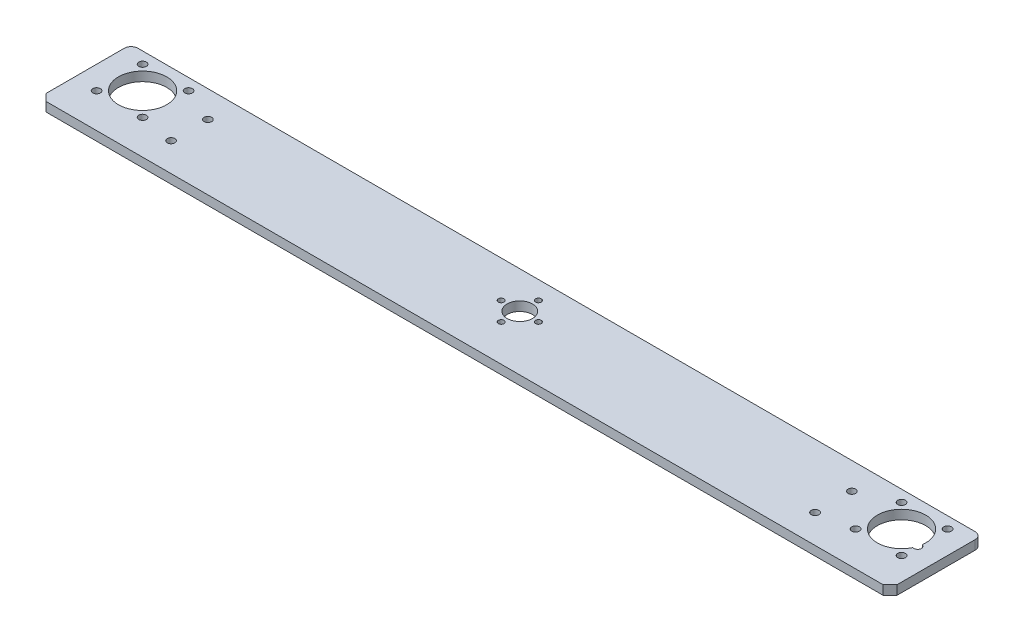
ISO-10303-21;
HEADER;
FILE_DESCRIPTION(('STEP AP214'),'2;1');
FILE_NAME('part.step','',(''),(''),'','','');
FILE_SCHEMA(('AUTOMOTIVE_DESIGN { 1 0 10303 214 1 1 1 1 }'));
ENDSEC;
DATA;
#1=APPLICATION_CONTEXT('core data for automotive mechanical design processes');
#2=APPLICATION_PROTOCOL_DEFINITION('international standard','automotive_design',2000,#1);
#3=PRODUCT_CONTEXT('',#1,'mechanical');
#4=PRODUCT('Part','Part','',(#3));
#5=PRODUCT_RELATED_PRODUCT_CATEGORY('part','',(#4));
#6=PRODUCT_DEFINITION_FORMATION('','',#4);
#7=PRODUCT_DEFINITION_CONTEXT('part definition',#1,'design');
#8=PRODUCT_DEFINITION('design','',#6,#7);
#9=PRODUCT_DEFINITION_SHAPE('','',#8);
#10=(LENGTH_UNIT() NAMED_UNIT(*) SI_UNIT(.MILLI.,.METRE.));
#11=(NAMED_UNIT(*) PLANE_ANGLE_UNIT() SI_UNIT($,.RADIAN.));
#12=(NAMED_UNIT(*) SI_UNIT($,.STERADIAN.) SOLID_ANGLE_UNIT());
#13=UNCERTAINTY_MEASURE_WITH_UNIT(LENGTH_MEASURE(1.E-05),#10,'distance_accuracy_value','');
#14=(GEOMETRIC_REPRESENTATION_CONTEXT(3) GLOBAL_UNCERTAINTY_ASSIGNED_CONTEXT((#13)) GLOBAL_UNIT_ASSIGNED_CONTEXT((#10,
#11,#12)) REPRESENTATION_CONTEXT('',''));
#15=CARTESIAN_POINT('',(0.,0.,0.));
#16=DIRECTION('',(0.,0.,1.));
#17=DIRECTION('',(1.,0.,0.));
#18=AXIS2_PLACEMENT_3D('',#15,#16,#17);
#19=CARTESIAN_POINT('',(185.,4.,-20.));
#20=DIRECTION('',(-1.,0.,0.));
#21=DIRECTION('',(0.,0.,1.));
#22=AXIS2_PLACEMENT_3D('',#19,#20,#21);
#23=PLANE('',#22);
#24=DIRECTION('',(0.,0.,-1.));
#25=VECTOR('',#24,1.);
#26=CARTESIAN_POINT('',(185.,0.,-20.));
#27=LINE('',#26,#25);
#28=CARTESIAN_POINT('',(185.,0.,16.9999999999999));
#29=VERTEX_POINT('',#28);
#30=CARTESIAN_POINT('',(185.,0.,-17.));
#31=VERTEX_POINT('',#30);
#32=EDGE_CURVE('E141',#29,#31,#27,.T.);
#33=ORIENTED_EDGE('',*,*,#32,.T.);
#34=DIRECTION('',(0.,-1.,0.));
#35=VECTOR('',#34,1.);
#36=CARTESIAN_POINT('',(185.,4.,-17.));
#37=LINE('',#36,#35);
#38=CARTESIAN_POINT('',(185.,4.,-17.));
#39=VERTEX_POINT('',#38);
#40=EDGE_CURVE('E11',#31,#39,#37,.F.);
#41=ORIENTED_EDGE('',*,*,#40,.T.);
#42=DIRECTION('',(0.,0.,-1.));
#43=VECTOR('',#42,1.);
#44=CARTESIAN_POINT('',(185.,4.,-20.));
#45=LINE('',#44,#43);
#46=CARTESIAN_POINT('',(185.,4.,16.9999999999999));
#47=VERTEX_POINT('',#46);
#48=EDGE_CURVE('E161',#47,#39,#45,.T.);
#49=ORIENTED_EDGE('',*,*,#48,.F.);
#50=DIRECTION('',(0.,-1.,0.));
#51=VECTOR('',#50,1.);
#52=CARTESIAN_POINT('',(185.,4.,16.9999999999999));
#53=LINE('',#52,#51);
#54=EDGE_CURVE('E193',#47,#29,#53,.T.);
#55=ORIENTED_EDGE('',*,*,#54,.T.);
#56=EDGE_LOOP('',(#33,#41,#49,#55));
#57=FACE_BOUND('',#56,.T.);
#58=ADVANCED_FACE('F41',(#57),#23,.F.);
#59=CARTESIAN_POINT('',(-185.,4.,-20.));
#60=DIRECTION('',(0.,0.,1.));
#61=DIRECTION('',(1.,0.,0.));
#62=AXIS2_PLACEMENT_3D('',#59,#60,#61);
#63=PLANE('',#62);
#64=DIRECTION('',(-1.,0.,0.));
#65=VECTOR('',#64,1.);
#66=CARTESIAN_POINT('',(-185.,0.,-20.));
#67=LINE('',#66,#65);
#68=CARTESIAN_POINT('',(182.,0.,-20.));
#69=VERTEX_POINT('',#68);
#70=CARTESIAN_POINT('',(-182.,0.,-20.));
#71=VERTEX_POINT('',#70);
#72=EDGE_CURVE('E143',#69,#71,#67,.T.);
#73=ORIENTED_EDGE('',*,*,#72,.T.);
#74=DIRECTION('',(0.,-1.,0.));
#75=VECTOR('',#74,1.);
#76=CARTESIAN_POINT('',(-182.,4.,-20.));
#77=LINE('',#76,#75);
#78=CARTESIAN_POINT('',(-182.,4.,-20.));
#79=VERTEX_POINT('',#78);
#80=EDGE_CURVE('E62',#71,#79,#77,.F.);
#81=ORIENTED_EDGE('',*,*,#80,.T.);
#82=DIRECTION('',(-1.,0.,0.));
#83=VECTOR('',#82,1.);
#84=CARTESIAN_POINT('',(-185.,4.,-20.));
#85=LINE('',#84,#83);
#86=CARTESIAN_POINT('',(182.,4.,-20.));
#87=VERTEX_POINT('',#86);
#88=EDGE_CURVE('E163',#87,#79,#85,.T.);
#89=ORIENTED_EDGE('',*,*,#88,.F.);
#90=DIRECTION('',(0.,-1.,0.));
#91=VECTOR('',#90,1.);
#92=CARTESIAN_POINT('',(182.,4.,-20.));
#93=LINE('',#92,#91);
#94=EDGE_CURVE('E203',#87,#69,#93,.T.);
#95=ORIENTED_EDGE('',*,*,#94,.T.);
#96=EDGE_LOOP('',(#73,#81,#89,#95));
#97=FACE_BOUND('',#96,.T.);
#98=ADVANCED_FACE('F222',(#97),#63,.F.);
#99=CARTESIAN_POINT('',(-185.,4.,-20.));
#100=DIRECTION('',(1.,0.,0.));
#101=DIRECTION('',(0.,0.,-1.));
#102=AXIS2_PLACEMENT_3D('',#99,#100,#101);
#103=PLANE('',#102);
#104=DIRECTION('',(0.,0.,1.));
#105=VECTOR('',#104,1.);
#106=CARTESIAN_POINT('',(-185.,4.,-20.));
#107=LINE('',#106,#105);
#108=CARTESIAN_POINT('',(-185.,4.,-17.));
#109=VERTEX_POINT('',#108);
#110=CARTESIAN_POINT('',(-185.,4.,16.9999999999999));
#111=VERTEX_POINT('',#110);
#112=EDGE_CURVE('E166',#109,#111,#107,.T.);
#113=ORIENTED_EDGE('',*,*,#112,.F.);
#114=DIRECTION('',(0.,-1.,0.));
#115=VECTOR('',#114,1.);
#116=CARTESIAN_POINT('',(-185.,4.,-17.));
#117=LINE('',#116,#115);
#118=CARTESIAN_POINT('',(-185.,0.,-17.));
#119=VERTEX_POINT('',#118);
#120=EDGE_CURVE('E196',#109,#119,#117,.T.);
#121=ORIENTED_EDGE('',*,*,#120,.T.);
#122=DIRECTION('',(0.,0.,1.));
#123=VECTOR('',#122,1.);
#124=CARTESIAN_POINT('',(-185.,0.,-20.));
#125=LINE('',#124,#123);
#126=CARTESIAN_POINT('',(-185.,0.,16.9999999999999));
#127=VERTEX_POINT('',#126);
#128=EDGE_CURVE('E171',#119,#127,#125,.T.);
#129=ORIENTED_EDGE('',*,*,#128,.T.);
#130=DIRECTION('',(0.,1.,0.));
#131=VECTOR('',#130,1.);
#132=CARTESIAN_POINT('',(-185.,4.,16.9999999999999));
#133=LINE('',#132,#131);
#134=EDGE_CURVE('E186',#127,#111,#133,.T.);
#135=ORIENTED_EDGE('',*,*,#134,.T.);
#136=EDGE_LOOP('',(#113,#121,#129,#135));
#137=FACE_BOUND('',#136,.T.);
#138=ADVANCED_FACE('F215',(#137),#103,.F.);
#139=CARTESIAN_POINT('',(-185.,4.,20.));
#140=DIRECTION('',(0.,0.,-1.));
#141=DIRECTION('',(-1.,0.,0.));
#142=AXIS2_PLACEMENT_3D('',#139,#140,#141);
#143=PLANE('',#142);
#144=DIRECTION('',(1.,0.,0.));
#145=VECTOR('',#144,1.);
#146=CARTESIAN_POINT('',(-185.,4.,20.));
#147=LINE('',#146,#145);
#148=CARTESIAN_POINT('',(-182.,4.,20.));
#149=VERTEX_POINT('',#148);
#150=CARTESIAN_POINT('',(182.,4.,20.));
#151=VERTEX_POINT('',#150);
#152=EDGE_CURVE('E130',#149,#151,#147,.T.);
#153=ORIENTED_EDGE('',*,*,#152,.F.);
#154=DIRECTION('',(0.,-1.,0.));
#155=VECTOR('',#154,1.);
#156=CARTESIAN_POINT('',(-182.,4.,20.));
#157=LINE('',#156,#155);
#158=CARTESIAN_POINT('',(-182.,0.,20.));
#159=VERTEX_POINT('',#158);
#160=EDGE_CURVE('E178',#149,#159,#157,.T.);
#161=ORIENTED_EDGE('',*,*,#160,.T.);
#162=DIRECTION('',(1.,0.,0.));
#163=VECTOR('',#162,1.);
#164=CARTESIAN_POINT('',(-185.,0.,20.));
#165=LINE('',#164,#163);
#166=CARTESIAN_POINT('',(182.,0.,20.));
#167=VERTEX_POINT('',#166);
#168=EDGE_CURVE('E164',#159,#167,#165,.T.);
#169=ORIENTED_EDGE('',*,*,#168,.T.);
#170=DIRECTION('',(0.,1.,0.));
#171=VECTOR('',#170,1.);
#172=CARTESIAN_POINT('',(182.,4.,20.));
#173=LINE('',#172,#171);
#174=EDGE_CURVE('E176',#167,#151,#173,.T.);
#175=ORIENTED_EDGE('',*,*,#174,.T.);
#176=EDGE_LOOP('',(#153,#161,#169,#175));
#177=FACE_BOUND('',#176,.T.);
#178=ADVANCED_FACE('F235',(#177),#143,.F.);
#179=CARTESIAN_POINT('',(0.,4.,0.));
#180=DIRECTION('',(0.,1.,0.));
#181=DIRECTION('',(0.,0.,1.));
#182=AXIS2_PLACEMENT_3D('',#179,#180,#181);
#183=PLANE('',#182);
#184=CARTESIAN_POINT('',(0.,4.,-12.1));
#185=DIRECTION('',(0.,1.,0.));
#186=DIRECTION('',(0.,0.,1.));
#187=AXIS2_PLACEMENT_3D('',#184,#185,#186);
#188=CIRCLE('',#187,1.25);
#189=CARTESIAN_POINT('',(0.,4.,-10.85));
#190=VERTEX_POINT('',#189);
#191=EDGE_CURVE('E345',#190,#190,#188,.T.);
#192=ORIENTED_EDGE('',*,*,#191,.F.);
#193=EDGE_LOOP('',(#192));
#194=FACE_BOUND('',#193,.T.);
#195=CARTESIAN_POINT('',(8.1,4.,-4.00000000000003));
#196=DIRECTION('',(0.,1.,0.));
#197=DIRECTION('',(0.,0.,1.));
#198=AXIS2_PLACEMENT_3D('',#195,#196,#197);
#199=CIRCLE('',#198,1.25);
#200=CARTESIAN_POINT('',(8.1,4.,-2.75000000000003));
#201=VERTEX_POINT('',#200);
#202=EDGE_CURVE('E347',#201,#201,#199,.T.);
#203=ORIENTED_EDGE('',*,*,#202,.F.);
#204=EDGE_LOOP('',(#203));
#205=FACE_BOUND('',#204,.T.);
#206=CARTESIAN_POINT('',(0.,4.,4.09999999999997));
#207=DIRECTION('',(0.,1.,0.));
#208=DIRECTION('',(0.,0.,1.));
#209=AXIS2_PLACEMENT_3D('',#206,#207,#208);
#210=CIRCLE('',#209,1.25);
#211=CARTESIAN_POINT('',(0.,4.,5.34999999999996));
#212=VERTEX_POINT('',#211);
#213=EDGE_CURVE('E355',#212,#212,#210,.T.);
#214=ORIENTED_EDGE('',*,*,#213,.F.);
#215=EDGE_LOOP('',(#214));
#216=FACE_BOUND('',#215,.T.);
#217=CARTESIAN_POINT('',(-8.1,4.,-4.00000000000001));
#218=DIRECTION('',(0.,1.,0.));
#219=DIRECTION('',(0.,0.,1.));
#220=AXIS2_PLACEMENT_3D('',#217,#218,#219);
#221=CIRCLE('',#220,1.25);
#222=CARTESIAN_POINT('',(-8.1,4.,-2.75000000000001));
#223=VERTEX_POINT('',#222);
#224=EDGE_CURVE('E361',#223,#223,#221,.T.);
#225=ORIENTED_EDGE('',*,*,#224,.F.);
#226=EDGE_LOOP('',(#225));
#227=FACE_BOUND('',#226,.T.);
#228=CARTESIAN_POINT('',(175.,4.,-2.00000000000003));
#229=DIRECTION('',(0.,1.,0.));
#230=DIRECTION('',(0.,0.,1.));
#231=AXIS2_PLACEMENT_3D('',#228,#229,#230);
#232=CIRCLE('',#231,1.64999999999998);
#233=CARTESIAN_POINT('',(174.458763345384,4.,-0.441294484612416));
#234=VERTEX_POINT('',#233);
#235=CARTESIAN_POINT('',(175.406144911497,4.,-3.59923303832339));
#236=VERTEX_POINT('',#235);
#237=EDGE_CURVE('E129',#234,#236,#232,.T.);
#238=ORIENTED_EDGE('',*,*,#237,.F.);
#239=CARTESIAN_POINT('',(165.,4.,-5.00000000000007));
#240=DIRECTION('',(0.,1.,0.));
#241=DIRECTION('',(0.,0.,1.));
#242=AXIS2_PLACEMENT_3D('',#239,#240,#241);
#243=CIRCLE('',#242,10.5);
#244=EDGE_CURVE('E137',#236,#234,#243,.T.);
#245=ORIENTED_EDGE('',*,*,#244,.F.);
#246=EDGE_LOOP('',(#238,#245));
#247=FACE_BOUND('',#246,.T.);
#248=CARTESIAN_POINT('',(155.,4.,-15.0000000000001));
#249=DIRECTION('',(0.,1.,0.));
#250=DIRECTION('',(0.,0.,1.));
#251=AXIS2_PLACEMENT_3D('',#248,#249,#250);
#252=CIRCLE('',#251,1.64999999999998);
#253=CARTESIAN_POINT('',(155.,4.,-13.3500000000001));
#254=VERTEX_POINT('',#253);
#255=EDGE_CURVE('E367',#254,#254,#252,.T.);
#256=ORIENTED_EDGE('',*,*,#255,.F.);
#257=EDGE_LOOP('',(#256));
#258=FACE_BOUND('',#257,.T.);
#259=CARTESIAN_POINT('',(175.,4.,-15.0000000000001));
#260=DIRECTION('',(0.,1.,0.));
#261=DIRECTION('',(0.,0.,1.));
#262=AXIS2_PLACEMENT_3D('',#259,#260,#261);
#263=CIRCLE('',#262,1.64999999999998);
#264=CARTESIAN_POINT('',(175.,4.,-13.3500000000001));
#265=VERTEX_POINT('',#264);
#266=EDGE_CURVE('E374',#265,#265,#263,.T.);
#267=ORIENTED_EDGE('',*,*,#266,.F.);
#268=EDGE_LOOP('',(#267));
#269=FACE_BOUND('',#268,.T.);
#270=CARTESIAN_POINT('',(155.,4.,4.99999999999994));
#271=DIRECTION('',(0.,1.,0.));
#272=DIRECTION('',(0.,0.,1.));
#273=AXIS2_PLACEMENT_3D('',#270,#271,#272);
#274=CIRCLE('',#273,1.64999999999998);
#275=CARTESIAN_POINT('',(155.,4.,6.64999999999992));
#276=VERTEX_POINT('',#275);
#277=EDGE_CURVE('E380',#276,#276,#274,.T.);
#278=ORIENTED_EDGE('',*,*,#277,.F.);
#279=EDGE_LOOP('',(#278));
#280=FACE_BOUND('',#279,.T.);
#281=CARTESIAN_POINT('',(175.,4.,4.99999999999994));
#282=DIRECTION('',(0.,1.,0.));
#283=DIRECTION('',(0.,0.,1.));
#284=AXIS2_PLACEMENT_3D('',#281,#282,#283);
#285=CIRCLE('',#284,1.64999999999998);
#286=CARTESIAN_POINT('',(175.,4.,6.64999999999992));
#287=VERTEX_POINT('',#286);
#288=EDGE_CURVE('E386',#287,#287,#285,.T.);
#289=ORIENTED_EDGE('',*,*,#288,.F.);
#290=EDGE_LOOP('',(#289));
#291=FACE_BOUND('',#290,.T.);
#292=CARTESIAN_POINT('',(-175.,4.,-15.0000000000001));
#293=DIRECTION('',(0.,1.,0.));
#294=DIRECTION('',(0.,0.,1.));
#295=AXIS2_PLACEMENT_3D('',#292,#293,#294);
#296=CIRCLE('',#295,1.64999999999998);
#297=CARTESIAN_POINT('',(-175.,4.,-13.3500000000001));
#298=VERTEX_POINT('',#297);
#299=EDGE_CURVE('E392',#298,#298,#296,.T.);
#300=ORIENTED_EDGE('',*,*,#299,.F.);
#301=EDGE_LOOP('',(#300));
#302=FACE_BOUND('',#301,.T.);
#303=CARTESIAN_POINT('',(-155.,4.,-15.0000000000001));
#304=DIRECTION('',(0.,1.,0.));
#305=DIRECTION('',(0.,0.,1.));
#306=AXIS2_PLACEMENT_3D('',#303,#304,#305);
#307=CIRCLE('',#306,1.64999999999998);
#308=CARTESIAN_POINT('',(-155.,4.,-13.3500000000001));
#309=VERTEX_POINT('',#308);
#310=EDGE_CURVE('E398',#309,#309,#307,.T.);
#311=ORIENTED_EDGE('',*,*,#310,.F.);
#312=EDGE_LOOP('',(#311));
#313=FACE_BOUND('',#312,.T.);
#314=CARTESIAN_POINT('',(-175.,4.,4.99999999999994));
#315=DIRECTION('',(0.,1.,0.));
#316=DIRECTION('',(0.,0.,1.));
#317=AXIS2_PLACEMENT_3D('',#314,#315,#316);
#318=CIRCLE('',#317,1.64999999999998);
#319=CARTESIAN_POINT('',(-175.,4.,6.64999999999992));
#320=VERTEX_POINT('',#319);
#321=EDGE_CURVE('E404',#320,#320,#318,.T.);
#322=ORIENTED_EDGE('',*,*,#321,.F.);
#323=EDGE_LOOP('',(#322));
#324=FACE_BOUND('',#323,.T.);
#325=CARTESIAN_POINT('',(-155.,4.,4.99999999999994));
#326=DIRECTION('',(0.,1.,0.));
#327=DIRECTION('',(0.,0.,1.));
#328=AXIS2_PLACEMENT_3D('',#325,#326,#327);
#329=CIRCLE('',#328,1.64999999999998);
#330=CARTESIAN_POINT('',(-155.,4.,6.64999999999992));
#331=VERTEX_POINT('',#330);
#332=EDGE_CURVE('E410',#331,#331,#329,.T.);
#333=ORIENTED_EDGE('',*,*,#332,.F.);
#334=EDGE_LOOP('',(#333));
#335=FACE_BOUND('',#334,.T.);
#336=CARTESIAN_POINT('',(-140.,4.,-8.39419179662788));
#337=DIRECTION('',(0.,1.,0.));
#338=DIRECTION('',(0.,0.,1.));
#339=AXIS2_PLACEMENT_3D('',#336,#337,#338);
#340=CIRCLE('',#339,1.64999999999998);
#341=CARTESIAN_POINT('',(-140.,4.,-6.7441917966279));
#342=VERTEX_POINT('',#341);
#343=EDGE_CURVE('E416',#342,#342,#340,.T.);
#344=ORIENTED_EDGE('',*,*,#343,.F.);
#345=EDGE_LOOP('',(#344));
#346=FACE_BOUND('',#345,.T.);
#347=CARTESIAN_POINT('',(-140.,4.,7.61068814492427));
#348=DIRECTION('',(0.,1.,0.));
#349=DIRECTION('',(0.,0.,1.));
#350=AXIS2_PLACEMENT_3D('',#347,#348,#349);
#351=CIRCLE('',#350,1.64999999999998);
#352=CARTESIAN_POINT('',(-140.,4.,9.26068814492426));
#353=VERTEX_POINT('',#352);
#354=EDGE_CURVE('E422',#353,#353,#351,.T.);
#355=ORIENTED_EDGE('',*,*,#354,.F.);
#356=EDGE_LOOP('',(#355));
#357=FACE_BOUND('',#356,.T.);
#358=CARTESIAN_POINT('',(140.,4.,-8.39419179662788));
#359=DIRECTION('',(0.,1.,0.));
#360=DIRECTION('',(0.,0.,1.));
#361=AXIS2_PLACEMENT_3D('',#358,#359,#360);
#362=CIRCLE('',#361,1.64999999999998);
#363=CARTESIAN_POINT('',(140.,4.,-6.7441917966279));
#364=VERTEX_POINT('',#363);
#365=EDGE_CURVE('E428',#364,#364,#362,.T.);
#366=ORIENTED_EDGE('',*,*,#365,.F.);
#367=EDGE_LOOP('',(#366));
#368=FACE_BOUND('',#367,.T.);
#369=CARTESIAN_POINT('',(140.,4.,7.61068814492427));
#370=DIRECTION('',(0.,1.,0.));
#371=DIRECTION('',(0.,0.,1.));
#372=AXIS2_PLACEMENT_3D('',#369,#370,#371);
#373=CIRCLE('',#372,1.64999999999998);
#374=CARTESIAN_POINT('',(140.,4.,9.26068814492426));
#375=VERTEX_POINT('',#374);
#376=EDGE_CURVE('E434',#375,#375,#373,.T.);
#377=ORIENTED_EDGE('',*,*,#376,.F.);
#378=EDGE_LOOP('',(#377));
#379=FACE_BOUND('',#378,.T.);
#380=CARTESIAN_POINT('',(-165.,4.,-5.00000000000003));
#381=DIRECTION('',(0.,1.,0.));
#382=DIRECTION('',(0.,0.,1.));
#383=AXIS2_PLACEMENT_3D('',#380,#381,#382);
#384=CIRCLE('',#383,10.5);
#385=CARTESIAN_POINT('',(-165.,4.,5.49999999999995));
#386=VERTEX_POINT('',#385);
#387=EDGE_CURVE('E149',#386,#386,#384,.T.);
#388=ORIENTED_EDGE('',*,*,#387,.F.);
#389=EDGE_LOOP('',(#388));
#390=FACE_BOUND('',#389,.T.);
#391=CARTESIAN_POINT('',(0.,4.,-4.00000000000003));
#392=DIRECTION('',(0.,1.,0.));
#393=DIRECTION('',(0.,0.,1.));
#394=AXIS2_PLACEMENT_3D('',#391,#392,#393);
#395=CIRCLE('',#394,5.5);
#396=CARTESIAN_POINT('',(0.,4.,1.49999999999996));
#397=VERTEX_POINT('',#396);
#398=EDGE_CURVE('E155',#397,#397,#395,.T.);
#399=ORIENTED_EDGE('',*,*,#398,.F.);
#400=EDGE_LOOP('',(#399));
#401=FACE_BOUND('',#400,.T.);
#402=ORIENTED_EDGE('',*,*,#88,.T.);
#403=CARTESIAN_POINT('',(-182.,4.,-17.));
#404=DIRECTION('',(0.,1.,0.));
#405=DIRECTION('',(0.,0.,1.));
#406=AXIS2_PLACEMENT_3D('',#403,#404,#405);
#407=CIRCLE('',#406,3.);
#408=EDGE_CURVE('E49',#79,#109,#407,.T.);
#409=ORIENTED_EDGE('',*,*,#408,.T.);
#410=ORIENTED_EDGE('',*,*,#112,.T.);
#411=DIRECTION('',(-0.707106781186541,0.,-0.707106781186554));
#412=VECTOR('',#411,1.);
#413=CARTESIAN_POINT('',(-101.000000000002,4.,101.));
#414=LINE('',#413,#412);
#415=EDGE_CURVE('E191',#111,#149,#414,.F.);
#416=ORIENTED_EDGE('',*,*,#415,.T.);
#417=ORIENTED_EDGE('',*,*,#152,.T.);
#418=DIRECTION('',(-0.707106781186548,0.,0.707106781186548));
#419=VECTOR('',#418,1.);
#420=CARTESIAN_POINT('',(101.,4.,101.));
#421=LINE('',#420,#419);
#422=EDGE_CURVE('E189',#151,#47,#421,.F.);
#423=ORIENTED_EDGE('',*,*,#422,.T.);
#424=ORIENTED_EDGE('',*,*,#48,.T.);
#425=CARTESIAN_POINT('',(182.,4.,-17.));
#426=DIRECTION('',(0.,1.,0.));
#427=DIRECTION('',(0.,0.,1.));
#428=AXIS2_PLACEMENT_3D('',#425,#426,#427);
#429=CIRCLE('',#428,3.);
#430=EDGE_CURVE('E207',#39,#87,#429,.T.);
#431=ORIENTED_EDGE('',*,*,#430,.T.);
#432=EDGE_LOOP('',(#402,#409,#410,#416,#417,#423,#424,#431));
#433=FACE_BOUND('',#432,.T.);
#434=ADVANCED_FACE('F211',(#194,#205,#216,#227,#247,#258,#269,#280,#291,#302,#313,#324,#335,
#346,#357,#368,#379,#390,#401,#433),#183,.T.);
#435=CARTESIAN_POINT('',(0.,0.,0.));
#436=DIRECTION('',(0.,1.,0.));
#437=DIRECTION('',(0.,0.,1.));
#438=AXIS2_PLACEMENT_3D('',#435,#436,#437);
#439=PLANE('',#438);
#440=CARTESIAN_POINT('',(0.,0.,-12.1));
#441=DIRECTION('',(0.,1.,0.));
#442=DIRECTION('',(0.,0.,1.));
#443=AXIS2_PLACEMENT_3D('',#440,#441,#442);
#444=CIRCLE('',#443,1.25);
#445=CARTESIAN_POINT('',(0.,0.,-10.85));
#446=VERTEX_POINT('',#445);
#447=EDGE_CURVE('E342',#446,#446,#444,.T.);
#448=ORIENTED_EDGE('',*,*,#447,.T.);
#449=EDGE_LOOP('',(#448));
#450=FACE_BOUND('',#449,.T.);
#451=CARTESIAN_POINT('',(8.1,0.,-4.00000000000003));
#452=DIRECTION('',(0.,1.,0.));
#453=DIRECTION('',(0.,0.,1.));
#454=AXIS2_PLACEMENT_3D('',#451,#452,#453);
#455=CIRCLE('',#454,1.25);
#456=CARTESIAN_POINT('',(8.1,0.,-2.75000000000003));
#457=VERTEX_POINT('',#456);
#458=EDGE_CURVE('E352',#457,#457,#455,.T.);
#459=ORIENTED_EDGE('',*,*,#458,.T.);
#460=EDGE_LOOP('',(#459));
#461=FACE_BOUND('',#460,.T.);
#462=CARTESIAN_POINT('',(0.,0.,4.09999999999997));
#463=DIRECTION('',(0.,1.,0.));
#464=DIRECTION('',(0.,0.,1.));
#465=AXIS2_PLACEMENT_3D('',#462,#463,#464);
#466=CIRCLE('',#465,1.25);
#467=CARTESIAN_POINT('',(0.,0.,5.34999999999996));
#468=VERTEX_POINT('',#467);
#469=EDGE_CURVE('E358',#468,#468,#466,.T.);
#470=ORIENTED_EDGE('',*,*,#469,.T.);
#471=EDGE_LOOP('',(#470));
#472=FACE_BOUND('',#471,.T.);
#473=CARTESIAN_POINT('',(-8.1,0.,-4.00000000000001));
#474=DIRECTION('',(0.,1.,0.));
#475=DIRECTION('',(0.,0.,1.));
#476=AXIS2_PLACEMENT_3D('',#473,#474,#475);
#477=CIRCLE('',#476,1.25);
#478=CARTESIAN_POINT('',(-8.1,0.,-2.75000000000001));
#479=VERTEX_POINT('',#478);
#480=EDGE_CURVE('E364',#479,#479,#477,.T.);
#481=ORIENTED_EDGE('',*,*,#480,.T.);
#482=EDGE_LOOP('',(#481));
#483=FACE_BOUND('',#482,.T.);
#484=CARTESIAN_POINT('',(155.,0.,-15.0000000000001));
#485=DIRECTION('',(0.,1.,0.));
#486=DIRECTION('',(0.,0.,1.));
#487=AXIS2_PLACEMENT_3D('',#484,#485,#486);
#488=CIRCLE('',#487,1.65);
#489=CARTESIAN_POINT('',(155.,0.,-13.3500000000001));
#490=VERTEX_POINT('',#489);
#491=EDGE_CURVE('E371',#490,#490,#488,.T.);
#492=ORIENTED_EDGE('',*,*,#491,.T.);
#493=EDGE_LOOP('',(#492));
#494=FACE_BOUND('',#493,.T.);
#495=CARTESIAN_POINT('',(175.,0.,-15.0000000000001));
#496=DIRECTION('',(0.,1.,0.));
#497=DIRECTION('',(0.,0.,1.));
#498=AXIS2_PLACEMENT_3D('',#495,#496,#497);
#499=CIRCLE('',#498,1.65);
#500=CARTESIAN_POINT('',(175.,0.,-13.3500000000001));
#501=VERTEX_POINT('',#500);
#502=EDGE_CURVE('E377',#501,#501,#499,.T.);
#503=ORIENTED_EDGE('',*,*,#502,.T.);
#504=EDGE_LOOP('',(#503));
#505=FACE_BOUND('',#504,.T.);
#506=CARTESIAN_POINT('',(155.,0.,4.99999999999994));
#507=DIRECTION('',(0.,1.,0.));
#508=DIRECTION('',(0.,0.,1.));
#509=AXIS2_PLACEMENT_3D('',#506,#507,#508);
#510=CIRCLE('',#509,1.65);
#511=CARTESIAN_POINT('',(155.,0.,6.64999999999994));
#512=VERTEX_POINT('',#511);
#513=EDGE_CURVE('E383',#512,#512,#510,.T.);
#514=ORIENTED_EDGE('',*,*,#513,.T.);
#515=EDGE_LOOP('',(#514));
#516=FACE_BOUND('',#515,.T.);
#517=CARTESIAN_POINT('',(175.,0.,4.99999999999994));
#518=DIRECTION('',(0.,1.,0.));
#519=DIRECTION('',(0.,0.,1.));
#520=AXIS2_PLACEMENT_3D('',#517,#518,#519);
#521=CIRCLE('',#520,1.65);
#522=CARTESIAN_POINT('',(175.,0.,6.64999999999994));
#523=VERTEX_POINT('',#522);
#524=EDGE_CURVE('E389',#523,#523,#521,.T.);
#525=ORIENTED_EDGE('',*,*,#524,.T.);
#526=EDGE_LOOP('',(#525));
#527=FACE_BOUND('',#526,.T.);
#528=CARTESIAN_POINT('',(-175.,0.,-15.0000000000001));
#529=DIRECTION('',(0.,1.,0.));
#530=DIRECTION('',(0.,0.,1.));
#531=AXIS2_PLACEMENT_3D('',#528,#529,#530);
#532=CIRCLE('',#531,1.65);
#533=CARTESIAN_POINT('',(-175.,0.,-13.3500000000001));
#534=VERTEX_POINT('',#533);
#535=EDGE_CURVE('E395',#534,#534,#532,.T.);
#536=ORIENTED_EDGE('',*,*,#535,.T.);
#537=EDGE_LOOP('',(#536));
#538=FACE_BOUND('',#537,.T.);
#539=CARTESIAN_POINT('',(-155.,0.,-15.0000000000001));
#540=DIRECTION('',(0.,1.,0.));
#541=DIRECTION('',(0.,0.,1.));
#542=AXIS2_PLACEMENT_3D('',#539,#540,#541);
#543=CIRCLE('',#542,1.65);
#544=CARTESIAN_POINT('',(-155.,0.,-13.3500000000001));
#545=VERTEX_POINT('',#544);
#546=EDGE_CURVE('E401',#545,#545,#543,.T.);
#547=ORIENTED_EDGE('',*,*,#546,.T.);
#548=EDGE_LOOP('',(#547));
#549=FACE_BOUND('',#548,.T.);
#550=CARTESIAN_POINT('',(-175.,0.,4.99999999999994));
#551=DIRECTION('',(0.,1.,0.));
#552=DIRECTION('',(0.,0.,1.));
#553=AXIS2_PLACEMENT_3D('',#550,#551,#552);
#554=CIRCLE('',#553,1.65);
#555=CARTESIAN_POINT('',(-175.,0.,6.64999999999994));
#556=VERTEX_POINT('',#555);
#557=EDGE_CURVE('E407',#556,#556,#554,.T.);
#558=ORIENTED_EDGE('',*,*,#557,.T.);
#559=EDGE_LOOP('',(#558));
#560=FACE_BOUND('',#559,.T.);
#561=CARTESIAN_POINT('',(-155.,0.,4.99999999999994));
#562=DIRECTION('',(0.,1.,0.));
#563=DIRECTION('',(0.,0.,1.));
#564=AXIS2_PLACEMENT_3D('',#561,#562,#563);
#565=CIRCLE('',#564,1.65);
#566=CARTESIAN_POINT('',(-155.,0.,6.64999999999994));
#567=VERTEX_POINT('',#566);
#568=EDGE_CURVE('E413',#567,#567,#565,.T.);
#569=ORIENTED_EDGE('',*,*,#568,.T.);
#570=EDGE_LOOP('',(#569));
#571=FACE_BOUND('',#570,.T.);
#572=CARTESIAN_POINT('',(-140.,0.,-8.39419179662788));
#573=DIRECTION('',(0.,1.,0.));
#574=DIRECTION('',(0.,0.,1.));
#575=AXIS2_PLACEMENT_3D('',#572,#573,#574);
#576=CIRCLE('',#575,1.65);
#577=CARTESIAN_POINT('',(-140.,0.,-6.74419179662789));
#578=VERTEX_POINT('',#577);
#579=EDGE_CURVE('E419',#578,#578,#576,.T.);
#580=ORIENTED_EDGE('',*,*,#579,.T.);
#581=EDGE_LOOP('',(#580));
#582=FACE_BOUND('',#581,.T.);
#583=CARTESIAN_POINT('',(-140.,0.,7.61068814492427));
#584=DIRECTION('',(0.,1.,0.));
#585=DIRECTION('',(0.,0.,1.));
#586=AXIS2_PLACEMENT_3D('',#583,#584,#585);
#587=CIRCLE('',#586,1.65);
#588=CARTESIAN_POINT('',(-140.,0.,9.26068814492427));
#589=VERTEX_POINT('',#588);
#590=EDGE_CURVE('E425',#589,#589,#587,.T.);
#591=ORIENTED_EDGE('',*,*,#590,.T.);
#592=EDGE_LOOP('',(#591));
#593=FACE_BOUND('',#592,.T.);
#594=CARTESIAN_POINT('',(140.,0.,-8.39419179662788));
#595=DIRECTION('',(0.,1.,0.));
#596=DIRECTION('',(0.,0.,1.));
#597=AXIS2_PLACEMENT_3D('',#594,#595,#596);
#598=CIRCLE('',#597,1.65);
#599=CARTESIAN_POINT('',(140.,0.,-6.74419179662789));
#600=VERTEX_POINT('',#599);
#601=EDGE_CURVE('E431',#600,#600,#598,.T.);
#602=ORIENTED_EDGE('',*,*,#601,.T.);
#603=EDGE_LOOP('',(#602));
#604=FACE_BOUND('',#603,.T.);
#605=CARTESIAN_POINT('',(140.,0.,7.61068814492427));
#606=DIRECTION('',(0.,1.,0.));
#607=DIRECTION('',(0.,0.,1.));
#608=AXIS2_PLACEMENT_3D('',#605,#606,#607);
#609=CIRCLE('',#608,1.65);
#610=CARTESIAN_POINT('',(140.,0.,9.26068814492427));
#611=VERTEX_POINT('',#610);
#612=EDGE_CURVE('E158',#611,#611,#609,.T.);
#613=ORIENTED_EDGE('',*,*,#612,.T.);
#614=EDGE_LOOP('',(#613));
#615=FACE_BOUND('',#614,.T.);
#616=CARTESIAN_POINT('',(165.,0.,-5.00000000000007));
#617=DIRECTION('',(0.,1.,0.));
#618=DIRECTION('',(0.,0.,1.));
#619=AXIS2_PLACEMENT_3D('',#616,#617,#618);
#620=CIRCLE('',#619,10.5);
#621=CARTESIAN_POINT('',(174.458763345384,0.,-0.441294484612387));
#622=VERTEX_POINT('',#621);
#623=CARTESIAN_POINT('',(175.406144911497,0.,-3.59923303832342));
#624=VERTEX_POINT('',#623);
#625=EDGE_CURVE('E135',#622,#624,#620,.F.);
#626=ORIENTED_EDGE('',*,*,#625,.F.);
#627=CARTESIAN_POINT('',(175.,0.,-2.00000000000003));
#628=DIRECTION('',(0.,1.,0.));
#629=DIRECTION('',(0.,0.,1.));
#630=AXIS2_PLACEMENT_3D('',#627,#628,#629);
#631=CIRCLE('',#630,1.65000000000001);
#632=EDGE_CURVE('E119',#622,#624,#631,.T.);
#633=ORIENTED_EDGE('',*,*,#632,.T.);
#634=EDGE_LOOP('',(#626,#633));
#635=FACE_BOUND('',#634,.T.);
#636=CARTESIAN_POINT('',(-165.,0.,-5.00000000000003));
#637=DIRECTION('',(0.,1.,0.));
#638=DIRECTION('',(0.,0.,1.));
#639=AXIS2_PLACEMENT_3D('',#636,#637,#638);
#640=CIRCLE('',#639,10.5);
#641=CARTESIAN_POINT('',(-165.,0.,5.49999999999995));
#642=VERTEX_POINT('',#641);
#643=EDGE_CURVE('E145',#642,#642,#640,.F.);
#644=ORIENTED_EDGE('',*,*,#643,.F.);
#645=EDGE_LOOP('',(#644));
#646=FACE_BOUND('',#645,.T.);
#647=CARTESIAN_POINT('',(0.,0.,-4.00000000000003));
#648=DIRECTION('',(0.,1.,0.));
#649=DIRECTION('',(0.,0.,1.));
#650=AXIS2_PLACEMENT_3D('',#647,#648,#649);
#651=CIRCLE('',#650,5.5);
#652=CARTESIAN_POINT('',(0.,0.,1.49999999999996));
#653=VERTEX_POINT('',#652);
#654=EDGE_CURVE('E152',#653,#653,#651,.F.);
#655=ORIENTED_EDGE('',*,*,#654,.F.);
#656=EDGE_LOOP('',(#655));
#657=FACE_BOUND('',#656,.T.);
#658=ORIENTED_EDGE('',*,*,#128,.F.);
#659=CARTESIAN_POINT('',(-182.,0.,-17.));
#660=DIRECTION('',(0.,1.,0.));
#661=DIRECTION('',(0.,0.,1.));
#662=AXIS2_PLACEMENT_3D('',#659,#660,#661);
#663=CIRCLE('',#662,3.);
#664=EDGE_CURVE('E201',#119,#71,#663,.F.);
#665=ORIENTED_EDGE('',*,*,#664,.T.);
#666=ORIENTED_EDGE('',*,*,#72,.F.);
#667=CARTESIAN_POINT('',(182.,0.,-17.));
#668=DIRECTION('',(0.,1.,0.));
#669=DIRECTION('',(0.,0.,1.));
#670=AXIS2_PLACEMENT_3D('',#667,#668,#669);
#671=CIRCLE('',#670,3.);
#672=EDGE_CURVE('E199',#69,#31,#671,.F.);
#673=ORIENTED_EDGE('',*,*,#672,.T.);
#674=ORIENTED_EDGE('',*,*,#32,.F.);
#675=DIRECTION('',(0.707106781186548,0.,-0.707106781186548));
#676=VECTOR('',#675,1.);
#677=CARTESIAN_POINT('',(185.,0.,16.9999999999999));
#678=LINE('',#677,#676);
#679=EDGE_CURVE('E181',#29,#167,#678,.F.);
#680=ORIENTED_EDGE('',*,*,#679,.T.);
#681=ORIENTED_EDGE('',*,*,#168,.F.);
#682=DIRECTION('',(0.707106781186541,0.,0.707106781186554));
#683=VECTOR('',#682,1.);
#684=CARTESIAN_POINT('',(-182.,0.,20.));
#685=LINE('',#684,#683);
#686=EDGE_CURVE('E183',#159,#127,#685,.F.);
#687=ORIENTED_EDGE('',*,*,#686,.T.);
#688=EDGE_LOOP('',(#658,#665,#666,#673,#674,#680,#681,#687));
#689=FACE_BOUND('',#688,.T.);
#690=ADVANCED_FACE('F139',(#450,#461,#472,#483,#494,#505,#516,#527,#538,#549,#560,#571,#582,
#593,#604,#615,#635,#646,#657,#689),#439,.F.);
#691=CARTESIAN_POINT('',(0.,-0.00100000000000013,-4.00000000000003));
#692=DIRECTION('',(0.,1.,0.));
#693=DIRECTION('',(0.,0.,1.));
#694=AXIS2_PLACEMENT_3D('',#691,#692,#693);
#695=CYLINDRICAL_SURFACE('',#694,5.5);
#696=ORIENTED_EDGE('',*,*,#398,.T.);
#697=EDGE_LOOP('',(#696));
#698=FACE_BOUND('',#697,.T.);
#699=ORIENTED_EDGE('',*,*,#654,.T.);
#700=EDGE_LOOP('',(#699));
#701=FACE_BOUND('',#700,.T.);
#702=ADVANCED_FACE('F261',(#698,#701),#695,.F.);
#703=CARTESIAN_POINT('',(-165.,-0.00100000000000013,-5.00000000000003));
#704=DIRECTION('',(0.,1.,0.));
#705=DIRECTION('',(0.,0.,1.));
#706=AXIS2_PLACEMENT_3D('',#703,#704,#705);
#707=CYLINDRICAL_SURFACE('',#706,10.5);
#708=ORIENTED_EDGE('',*,*,#387,.T.);
#709=EDGE_LOOP('',(#708));
#710=FACE_BOUND('',#709,.T.);
#711=ORIENTED_EDGE('',*,*,#643,.T.);
#712=EDGE_LOOP('',(#711));
#713=FACE_BOUND('',#712,.T.);
#714=ADVANCED_FACE('F268',(#710,#713),#707,.F.);
#715=CARTESIAN_POINT('',(165.,-0.00100000000000013,-5.00000000000007));
#716=DIRECTION('',(0.,1.,0.));
#717=DIRECTION('',(0.,0.,1.));
#718=AXIS2_PLACEMENT_3D('',#715,#716,#717);
#719=CYLINDRICAL_SURFACE('',#718,10.5);
#720=ORIENTED_EDGE('',*,*,#625,.T.);
#721=DIRECTION('',(0.,1.,0.));
#722=VECTOR('',#721,1.);
#723=CARTESIAN_POINT('',(175.406144911497,2.,-3.59923303832341));
#724=LINE('',#723,#722);
#725=EDGE_CURVE('E125',#624,#236,#724,.T.);
#726=ORIENTED_EDGE('',*,*,#725,.T.);
#727=ORIENTED_EDGE('',*,*,#244,.T.);
#728=DIRECTION('',(0.,1.,0.));
#729=VECTOR('',#728,1.);
#730=CARTESIAN_POINT('',(174.458763345384,2.,-0.441294484612402));
#731=LINE('',#730,#729);
#732=EDGE_CURVE('E122',#234,#622,#731,.F.);
#733=ORIENTED_EDGE('',*,*,#732,.T.);
#734=EDGE_LOOP('',(#720,#726,#727,#733));
#735=FACE_BOUND('',#734,.T.);
#736=ADVANCED_FACE('F134',(#735),#719,.F.);
#737=CARTESIAN_POINT('',(140.,4.,7.61068814492427));
#738=DIRECTION('',(0.,1.,0.));
#739=DIRECTION('',(0.,0.,1.));
#740=AXIS2_PLACEMENT_3D('',#737,#738,#739);
#741=CYLINDRICAL_SURFACE('',#740,1.65);
#742=ORIENTED_EDGE('',*,*,#612,.F.);
#743=EDGE_LOOP('',(#742));
#744=FACE_BOUND('',#743,.T.);
#745=ORIENTED_EDGE('',*,*,#376,.T.);
#746=EDGE_LOOP('',(#745));
#747=FACE_BOUND('',#746,.T.);
#748=ADVANCED_FACE('F275',(#744,#747),#741,.F.);
#749=CARTESIAN_POINT('',(140.,4.,-8.39419179662788));
#750=DIRECTION('',(0.,1.,0.));
#751=DIRECTION('',(0.,0.,1.));
#752=AXIS2_PLACEMENT_3D('',#749,#750,#751);
#753=CYLINDRICAL_SURFACE('',#752,1.65);
#754=ORIENTED_EDGE('',*,*,#601,.F.);
#755=EDGE_LOOP('',(#754));
#756=FACE_BOUND('',#755,.T.);
#757=ORIENTED_EDGE('',*,*,#365,.T.);
#758=EDGE_LOOP('',(#757));
#759=FACE_BOUND('',#758,.T.);
#760=ADVANCED_FACE('F278',(#756,#759),#753,.F.);
#761=CARTESIAN_POINT('',(-140.,4.,7.61068814492427));
#762=DIRECTION('',(0.,1.,0.));
#763=DIRECTION('',(0.,0.,1.));
#764=AXIS2_PLACEMENT_3D('',#761,#762,#763);
#765=CYLINDRICAL_SURFACE('',#764,1.65);
#766=ORIENTED_EDGE('',*,*,#590,.F.);
#767=EDGE_LOOP('',(#766));
#768=FACE_BOUND('',#767,.T.);
#769=ORIENTED_EDGE('',*,*,#354,.T.);
#770=EDGE_LOOP('',(#769));
#771=FACE_BOUND('',#770,.T.);
#772=ADVANCED_FACE('F282',(#768,#771),#765,.F.);
#773=CARTESIAN_POINT('',(-140.,4.,-8.39419179662788));
#774=DIRECTION('',(0.,1.,0.));
#775=DIRECTION('',(0.,0.,1.));
#776=AXIS2_PLACEMENT_3D('',#773,#774,#775);
#777=CYLINDRICAL_SURFACE('',#776,1.65);
#778=ORIENTED_EDGE('',*,*,#579,.F.);
#779=EDGE_LOOP('',(#778));
#780=FACE_BOUND('',#779,.T.);
#781=ORIENTED_EDGE('',*,*,#343,.T.);
#782=EDGE_LOOP('',(#781));
#783=FACE_BOUND('',#782,.T.);
#784=ADVANCED_FACE('F286',(#780,#783),#777,.F.);
#785=CARTESIAN_POINT('',(-155.,4.,4.99999999999994));
#786=DIRECTION('',(0.,1.,0.));
#787=DIRECTION('',(0.,0.,1.));
#788=AXIS2_PLACEMENT_3D('',#785,#786,#787);
#789=CYLINDRICAL_SURFACE('',#788,1.65);
#790=ORIENTED_EDGE('',*,*,#568,.F.);
#791=EDGE_LOOP('',(#790));
#792=FACE_BOUND('',#791,.T.);
#793=ORIENTED_EDGE('',*,*,#332,.T.);
#794=EDGE_LOOP('',(#793));
#795=FACE_BOUND('',#794,.T.);
#796=ADVANCED_FACE('F290',(#792,#795),#789,.F.);
#797=CARTESIAN_POINT('',(-175.,4.,4.99999999999994));
#798=DIRECTION('',(0.,1.,0.));
#799=DIRECTION('',(0.,0.,1.));
#800=AXIS2_PLACEMENT_3D('',#797,#798,#799);
#801=CYLINDRICAL_SURFACE('',#800,1.65);
#802=ORIENTED_EDGE('',*,*,#557,.F.);
#803=EDGE_LOOP('',(#802));
#804=FACE_BOUND('',#803,.T.);
#805=ORIENTED_EDGE('',*,*,#321,.T.);
#806=EDGE_LOOP('',(#805));
#807=FACE_BOUND('',#806,.T.);
#808=ADVANCED_FACE('F294',(#804,#807),#801,.F.);
#809=CARTESIAN_POINT('',(-155.,4.,-15.0000000000001));
#810=DIRECTION('',(0.,1.,0.));
#811=DIRECTION('',(0.,0.,1.));
#812=AXIS2_PLACEMENT_3D('',#809,#810,#811);
#813=CYLINDRICAL_SURFACE('',#812,1.65);
#814=ORIENTED_EDGE('',*,*,#546,.F.);
#815=EDGE_LOOP('',(#814));
#816=FACE_BOUND('',#815,.T.);
#817=ORIENTED_EDGE('',*,*,#310,.T.);
#818=EDGE_LOOP('',(#817));
#819=FACE_BOUND('',#818,.T.);
#820=ADVANCED_FACE('F298',(#816,#819),#813,.F.);
#821=CARTESIAN_POINT('',(-175.,4.,-15.0000000000001));
#822=DIRECTION('',(0.,1.,0.));
#823=DIRECTION('',(0.,0.,1.));
#824=AXIS2_PLACEMENT_3D('',#821,#822,#823);
#825=CYLINDRICAL_SURFACE('',#824,1.65);
#826=ORIENTED_EDGE('',*,*,#535,.F.);
#827=EDGE_LOOP('',(#826));
#828=FACE_BOUND('',#827,.T.);
#829=ORIENTED_EDGE('',*,*,#299,.T.);
#830=EDGE_LOOP('',(#829));
#831=FACE_BOUND('',#830,.T.);
#832=ADVANCED_FACE('F302',(#828,#831),#825,.F.);
#833=CARTESIAN_POINT('',(175.,4.,4.99999999999994));
#834=DIRECTION('',(0.,1.,0.));
#835=DIRECTION('',(0.,0.,1.));
#836=AXIS2_PLACEMENT_3D('',#833,#834,#835);
#837=CYLINDRICAL_SURFACE('',#836,1.65);
#838=ORIENTED_EDGE('',*,*,#524,.F.);
#839=EDGE_LOOP('',(#838));
#840=FACE_BOUND('',#839,.T.);
#841=ORIENTED_EDGE('',*,*,#288,.T.);
#842=EDGE_LOOP('',(#841));
#843=FACE_BOUND('',#842,.T.);
#844=ADVANCED_FACE('F306',(#840,#843),#837,.F.);
#845=CARTESIAN_POINT('',(155.,4.,4.99999999999994));
#846=DIRECTION('',(0.,1.,0.));
#847=DIRECTION('',(0.,0.,1.));
#848=AXIS2_PLACEMENT_3D('',#845,#846,#847);
#849=CYLINDRICAL_SURFACE('',#848,1.65);
#850=ORIENTED_EDGE('',*,*,#513,.F.);
#851=EDGE_LOOP('',(#850));
#852=FACE_BOUND('',#851,.T.);
#853=ORIENTED_EDGE('',*,*,#277,.T.);
#854=EDGE_LOOP('',(#853));
#855=FACE_BOUND('',#854,.T.);
#856=ADVANCED_FACE('F310',(#852,#855),#849,.F.);
#857=CARTESIAN_POINT('',(175.,4.,-15.0000000000001));
#858=DIRECTION('',(0.,1.,0.));
#859=DIRECTION('',(0.,0.,1.));
#860=AXIS2_PLACEMENT_3D('',#857,#858,#859);
#861=CYLINDRICAL_SURFACE('',#860,1.65);
#862=ORIENTED_EDGE('',*,*,#502,.F.);
#863=EDGE_LOOP('',(#862));
#864=FACE_BOUND('',#863,.T.);
#865=ORIENTED_EDGE('',*,*,#266,.T.);
#866=EDGE_LOOP('',(#865));
#867=FACE_BOUND('',#866,.T.);
#868=ADVANCED_FACE('F314',(#864,#867),#861,.F.);
#869=CARTESIAN_POINT('',(155.,4.,-15.0000000000001));
#870=DIRECTION('',(0.,1.,0.));
#871=DIRECTION('',(0.,0.,1.));
#872=AXIS2_PLACEMENT_3D('',#869,#870,#871);
#873=CYLINDRICAL_SURFACE('',#872,1.65);
#874=ORIENTED_EDGE('',*,*,#491,.F.);
#875=EDGE_LOOP('',(#874));
#876=FACE_BOUND('',#875,.T.);
#877=ORIENTED_EDGE('',*,*,#255,.T.);
#878=EDGE_LOOP('',(#877));
#879=FACE_BOUND('',#878,.T.);
#880=ADVANCED_FACE('F246',(#876,#879),#873,.F.);
#881=CARTESIAN_POINT('',(175.,4.,-2.00000000000003));
#882=DIRECTION('',(0.,1.,0.));
#883=DIRECTION('',(0.,0.,1.));
#884=AXIS2_PLACEMENT_3D('',#881,#882,#883);
#885=CYLINDRICAL_SURFACE('',#884,1.65);
#886=ORIENTED_EDGE('',*,*,#632,.F.);
#887=ORIENTED_EDGE('',*,*,#732,.F.);
#888=ORIENTED_EDGE('',*,*,#237,.T.);
#889=ORIENTED_EDGE('',*,*,#725,.F.);
#890=EDGE_LOOP('',(#886,#887,#888,#889));
#891=FACE_BOUND('',#890,.T.);
#892=ADVANCED_FACE('F121',(#891),#885,.F.);
#893=CARTESIAN_POINT('',(-182.,4.,20.));
#894=DIRECTION('',(0.707106781186555,0.,-0.707106781186541));
#895=DIRECTION('',(0.,-1.,0.));
#896=AXIS2_PLACEMENT_3D('',#893,#894,#895);
#897=PLANE('',#896);
#898=ORIENTED_EDGE('',*,*,#415,.F.);
#899=ORIENTED_EDGE('',*,*,#134,.F.);
#900=ORIENTED_EDGE('',*,*,#686,.F.);
#901=ORIENTED_EDGE('',*,*,#160,.F.);
#902=EDGE_LOOP('',(#898,#899,#900,#901));
#903=FACE_BOUND('',#902,.T.);
#904=ADVANCED_FACE('F238',(#903),#897,.F.);
#905=CARTESIAN_POINT('',(185.,4.,16.9999999999999));
#906=DIRECTION('',(-0.707106781186548,0.,-0.707106781186548));
#907=DIRECTION('',(0.,-1.,0.));
#908=AXIS2_PLACEMENT_3D('',#905,#906,#907);
#909=PLANE('',#908);
#910=ORIENTED_EDGE('',*,*,#422,.F.);
#911=ORIENTED_EDGE('',*,*,#174,.F.);
#912=ORIENTED_EDGE('',*,*,#679,.F.);
#913=ORIENTED_EDGE('',*,*,#54,.F.);
#914=EDGE_LOOP('',(#910,#911,#912,#913));
#915=FACE_BOUND('',#914,.T.);
#916=ADVANCED_FACE('F230',(#915),#909,.F.);
#917=CARTESIAN_POINT('',(-182.,4.,-17.));
#918=DIRECTION('',(0.,-1.,0.));
#919=DIRECTION('',(0.,0.,-1.));
#920=AXIS2_PLACEMENT_3D('',#917,#918,#919);
#921=CYLINDRICAL_SURFACE('',#920,3.);
#922=ORIENTED_EDGE('',*,*,#408,.F.);
#923=ORIENTED_EDGE('',*,*,#80,.F.);
#924=ORIENTED_EDGE('',*,*,#664,.F.);
#925=ORIENTED_EDGE('',*,*,#120,.F.);
#926=EDGE_LOOP('',(#922,#923,#924,#925));
#927=FACE_BOUND('',#926,.T.);
#928=ADVANCED_FACE('F219',(#927),#921,.T.);
#929=CARTESIAN_POINT('',(182.,4.,-17.));
#930=DIRECTION('',(0.,-1.,0.));
#931=DIRECTION('',(0.,0.,-1.));
#932=AXIS2_PLACEMENT_3D('',#929,#930,#931);
#933=CYLINDRICAL_SURFACE('',#932,3.);
#934=ORIENTED_EDGE('',*,*,#430,.F.);
#935=ORIENTED_EDGE('',*,*,#40,.F.);
#936=ORIENTED_EDGE('',*,*,#672,.F.);
#937=ORIENTED_EDGE('',*,*,#94,.F.);
#938=EDGE_LOOP('',(#934,#935,#936,#937));
#939=FACE_BOUND('',#938,.T.);
#940=ADVANCED_FACE('F43',(#939),#933,.T.);
#941=CARTESIAN_POINT('',(-8.1,4.,-4.00000000000001));
#942=DIRECTION('',(0.,1.,0.));
#943=DIRECTION('',(0.,0.,1.));
#944=AXIS2_PLACEMENT_3D('',#941,#942,#943);
#945=CYLINDRICAL_SURFACE('',#944,1.25);
#946=ORIENTED_EDGE('',*,*,#480,.F.);
#947=EDGE_LOOP('',(#946));
#948=FACE_BOUND('',#947,.T.);
#949=ORIENTED_EDGE('',*,*,#224,.T.);
#950=EDGE_LOOP('',(#949));
#951=FACE_BOUND('',#950,.T.);
#952=ADVANCED_FACE('F322',(#948,#951),#945,.F.);
#953=CARTESIAN_POINT('',(0.,4.,4.09999999999997));
#954=DIRECTION('',(0.,1.,0.));
#955=DIRECTION('',(0.,0.,1.));
#956=AXIS2_PLACEMENT_3D('',#953,#954,#955);
#957=CYLINDRICAL_SURFACE('',#956,1.25);
#958=ORIENTED_EDGE('',*,*,#469,.F.);
#959=EDGE_LOOP('',(#958));
#960=FACE_BOUND('',#959,.T.);
#961=ORIENTED_EDGE('',*,*,#213,.T.);
#962=EDGE_LOOP('',(#961));
#963=FACE_BOUND('',#962,.T.);
#964=ADVANCED_FACE('F325',(#960,#963),#957,.F.);
#965=CARTESIAN_POINT('',(8.1,4.,-4.00000000000003));
#966=DIRECTION('',(0.,1.,0.));
#967=DIRECTION('',(0.,0.,1.));
#968=AXIS2_PLACEMENT_3D('',#965,#966,#967);
#969=CYLINDRICAL_SURFACE('',#968,1.25);
#970=ORIENTED_EDGE('',*,*,#458,.F.);
#971=EDGE_LOOP('',(#970));
#972=FACE_BOUND('',#971,.T.);
#973=ORIENTED_EDGE('',*,*,#202,.T.);
#974=EDGE_LOOP('',(#973));
#975=FACE_BOUND('',#974,.T.);
#976=ADVANCED_FACE('F329',(#972,#975),#969,.F.);
#977=CARTESIAN_POINT('',(0.,4.,-12.1));
#978=DIRECTION('',(0.,1.,0.));
#979=DIRECTION('',(0.,0.,1.));
#980=AXIS2_PLACEMENT_3D('',#977,#978,#979);
#981=CYLINDRICAL_SURFACE('',#980,1.25);
#982=ORIENTED_EDGE('',*,*,#447,.F.);
#983=EDGE_LOOP('',(#982));
#984=FACE_BOUND('',#983,.T.);
#985=ORIENTED_EDGE('',*,*,#191,.T.);
#986=EDGE_LOOP('',(#985));
#987=FACE_BOUND('',#986,.T.);
#988=ADVANCED_FACE('F333',(#984,#987),#981,.F.);
#989=CLOSED_SHELL('',(#58,#98,#138,#178,#434,#690,#702,#714,#736,#748,#760,#772,#784,#796,#808,
#820,#832,#844,#856,#868,#880,#892,#904,#916,#928,#940,#952,#964,#976,#988));
#990=MANIFOLD_SOLID_BREP('B2',#989);
#991=ADVANCED_BREP_SHAPE_REPRESENTATION('',(#18,#990),#14);
#992=SHAPE_DEFINITION_REPRESENTATION(#9,#991);
ENDSEC;
END-ISO-10303-21;
